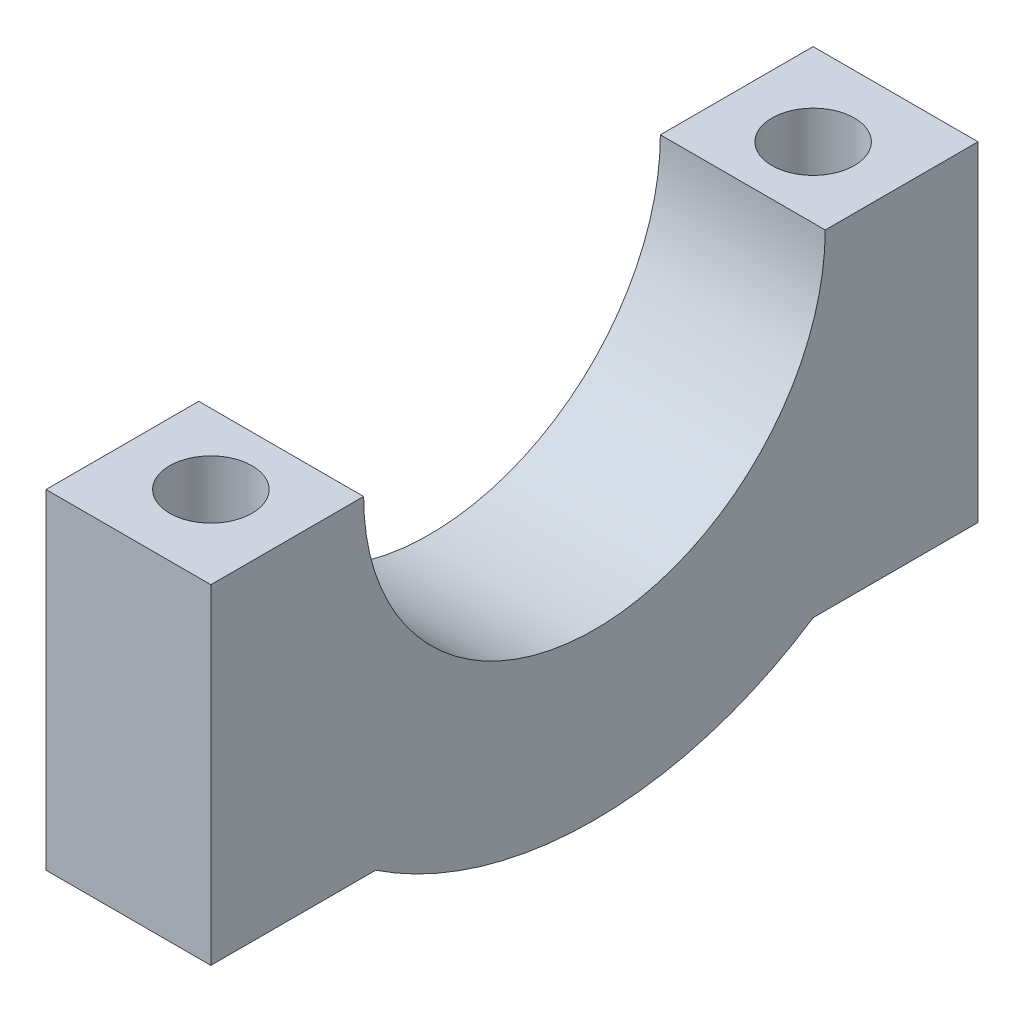
ISO-10303-21;
HEADER;
FILE_DESCRIPTION(('STEP AP214'),'2;1');
FILE_NAME('part.step','',(''),(''),'','','');
FILE_SCHEMA(('AUTOMOTIVE_DESIGN { 1 0 10303 214 1 1 1 1 }'));
ENDSEC;
DATA;
#1=APPLICATION_CONTEXT('core data for automotive mechanical design processes');
#2=APPLICATION_PROTOCOL_DEFINITION('international standard','automotive_design',2000,#1);
#3=PRODUCT_CONTEXT('',#1,'mechanical');
#4=PRODUCT('Part','Part','',(#3));
#5=PRODUCT_RELATED_PRODUCT_CATEGORY('part','',(#4));
#6=PRODUCT_DEFINITION_FORMATION('','',#4);
#7=PRODUCT_DEFINITION_CONTEXT('part definition',#1,'design');
#8=PRODUCT_DEFINITION('design','',#6,#7);
#9=PRODUCT_DEFINITION_SHAPE('','',#8);
#10=(LENGTH_UNIT() NAMED_UNIT(*) SI_UNIT(.MILLI.,.METRE.));
#11=(NAMED_UNIT(*) PLANE_ANGLE_UNIT() SI_UNIT($,.RADIAN.));
#12=(NAMED_UNIT(*) SI_UNIT($,.STERADIAN.) SOLID_ANGLE_UNIT());
#13=UNCERTAINTY_MEASURE_WITH_UNIT(LENGTH_MEASURE(1.E-05),#10,'distance_accuracy_value','');
#14=(GEOMETRIC_REPRESENTATION_CONTEXT(3) GLOBAL_UNCERTAINTY_ASSIGNED_CONTEXT((#13)) GLOBAL_UNIT_ASSIGNED_CONTEXT((#10,
#11,#12)) REPRESENTATION_CONTEXT('',''));
#15=CARTESIAN_POINT('',(0.,0.,0.));
#16=DIRECTION('',(0.,0.,1.));
#17=DIRECTION('',(1.,0.,0.));
#18=AXIS2_PLACEMENT_3D('',#15,#16,#17);
#19=CARTESIAN_POINT('',(12.7,0.,0.));
#20=DIRECTION('',(-1.,0.,0.));
#21=DIRECTION('',(0.,0.,1.));
#22=AXIS2_PLACEMENT_3D('',#19,#20,#21);
#23=CYLINDRICAL_SURFACE('',#22,17.78);
#24=CARTESIAN_POINT('',(0.,0.,0.));
#25=DIRECTION('',(-1.,0.,0.));
#26=DIRECTION('',(0.,0.,-1.));
#27=AXIS2_PLACEMENT_3D('',#24,#25,#26);
#28=CIRCLE('',#27,17.78);
#29=CARTESIAN_POINT('',(0.,0.,-17.78));
#30=VERTEX_POINT('',#29);
#31=CARTESIAN_POINT('',(0.,0.,17.78));
#32=VERTEX_POINT('',#31);
#33=EDGE_CURVE('E136',#30,#32,#28,.T.);
#34=ORIENTED_EDGE('',*,*,#33,.T.);
#35=DIRECTION('',(-1.,0.,0.));
#36=VECTOR('',#35,1.);
#37=CARTESIAN_POINT('',(12.7,0.,17.78));
#38=LINE('',#37,#36);
#39=CARTESIAN_POINT('',(12.7,0.,17.78));
#40=VERTEX_POINT('',#39);
#41=EDGE_CURVE('E11',#40,#32,#38,.T.);
#42=ORIENTED_EDGE('',*,*,#41,.F.);
#43=CARTESIAN_POINT('',(12.7,0.,0.));
#44=DIRECTION('',(-1.,0.,0.));
#45=DIRECTION('',(0.,0.,-1.));
#46=AXIS2_PLACEMENT_3D('',#43,#44,#45);
#47=CIRCLE('',#46,17.78);
#48=CARTESIAN_POINT('',(12.7,0.,-17.78));
#49=VERTEX_POINT('',#48);
#50=EDGE_CURVE('E151',#49,#40,#47,.T.);
#51=ORIENTED_EDGE('',*,*,#50,.F.);
#52=DIRECTION('',(-1.,0.,0.));
#53=VECTOR('',#52,1.);
#54=CARTESIAN_POINT('',(12.7,0.,-17.78));
#55=LINE('',#54,#53);
#56=EDGE_CURVE('E132',#49,#30,#55,.T.);
#57=ORIENTED_EDGE('',*,*,#56,.T.);
#58=EDGE_LOOP('',(#34,#42,#51,#57));
#59=FACE_BOUND('',#58,.T.);
#60=ADVANCED_FACE('F40',(#59),#23,.F.);
#61=CARTESIAN_POINT('',(12.7,0.,17.78));
#62=DIRECTION('',(0.,-1.,0.));
#63=DIRECTION('',(0.,0.,-1.));
#64=AXIS2_PLACEMENT_3D('',#61,#62,#63);
#65=PLANE('',#64);
#66=CARTESIAN_POINT('',(6.35,0.,23.1984539350054));
#67=DIRECTION('',(0.,-1.,0.));
#68=DIRECTION('',(0.,0.,-1.));
#69=AXIS2_PLACEMENT_3D('',#66,#67,#68);
#70=CIRCLE('',#69,3.175);
#71=CARTESIAN_POINT('',(6.35,0.,20.0234539350054));
#72=VERTEX_POINT('',#71);
#73=EDGE_CURVE('E184',#72,#72,#70,.T.);
#74=ORIENTED_EDGE('',*,*,#73,.T.);
#75=EDGE_LOOP('',(#74));
#76=FACE_BOUND('',#75,.T.);
#77=DIRECTION('',(0.,0.,1.));
#78=VECTOR('',#77,1.);
#79=CARTESIAN_POINT('',(0.,0.,17.78));
#80=LINE('',#79,#78);
#81=CARTESIAN_POINT('',(0.,0.,29.5484539350054));
#82=VERTEX_POINT('',#81);
#83=EDGE_CURVE('E139',#32,#82,#80,.T.);
#84=ORIENTED_EDGE('',*,*,#83,.T.);
#85=DIRECTION('',(-1.,0.,0.));
#86=VECTOR('',#85,1.);
#87=CARTESIAN_POINT('',(12.7,0.,29.5484539350054));
#88=LINE('',#87,#86);
#89=CARTESIAN_POINT('',(12.7,0.,29.5484539350054));
#90=VERTEX_POINT('',#89);
#91=EDGE_CURVE('E48',#90,#82,#88,.T.);
#92=ORIENTED_EDGE('',*,*,#91,.F.);
#93=DIRECTION('',(0.,0.,1.));
#94=VECTOR('',#93,1.);
#95=CARTESIAN_POINT('',(12.7,0.,17.78));
#96=LINE('',#95,#94);
#97=EDGE_CURVE('E99',#40,#90,#96,.T.);
#98=ORIENTED_EDGE('',*,*,#97,.F.);
#99=ORIENTED_EDGE('',*,*,#41,.T.);
#100=EDGE_LOOP('',(#84,#92,#98,#99));
#101=FACE_BOUND('',#100,.T.);
#102=ADVANCED_FACE('F216',(#76,#101),#65,.F.);
#103=CARTESIAN_POINT('',(12.7,0.,29.5484539350054));
#104=DIRECTION('',(0.,0.,-1.));
#105=DIRECTION('',(-1.,0.,0.));
#106=AXIS2_PLACEMENT_3D('',#103,#104,#105);
#107=PLANE('',#106);
#108=DIRECTION('',(0.,-1.,0.));
#109=VECTOR('',#108,1.);
#110=CARTESIAN_POINT('',(0.,0.,29.5484539350054));
#111=LINE('',#110,#109);
#112=CARTESIAN_POINT('',(0.,-25.4,29.5484539350054));
#113=VERTEX_POINT('',#112);
#114=EDGE_CURVE('E142',#82,#113,#111,.T.);
#115=ORIENTED_EDGE('',*,*,#114,.T.);
#116=DIRECTION('',(-1.,0.,0.));
#117=VECTOR('',#116,1.);
#118=CARTESIAN_POINT('',(12.7,-25.4,29.5484539350054));
#119=LINE('',#118,#117);
#120=CARTESIAN_POINT('',(12.7,-25.4,29.5484539350054));
#121=VERTEX_POINT('',#120);
#122=EDGE_CURVE('E158',#121,#113,#119,.T.);
#123=ORIENTED_EDGE('',*,*,#122,.F.);
#124=DIRECTION('',(0.,-1.,0.));
#125=VECTOR('',#124,1.);
#126=CARTESIAN_POINT('',(12.7,0.,29.5484539350054));
#127=LINE('',#126,#125);
#128=EDGE_CURVE('E166',#90,#121,#127,.T.);
#129=ORIENTED_EDGE('',*,*,#128,.F.);
#130=ORIENTED_EDGE('',*,*,#91,.T.);
#131=EDGE_LOOP('',(#115,#123,#129,#130));
#132=FACE_BOUND('',#131,.T.);
#133=ADVANCED_FACE('F164',(#132),#107,.F.);
#134=CARTESIAN_POINT('',(12.7,-25.4,29.5484539350054));
#135=DIRECTION('',(0.,1.,0.));
#136=DIRECTION('',(0.,0.,1.));
#137=AXIS2_PLACEMENT_3D('',#134,#135,#136);
#138=PLANE('',#137);
#139=CARTESIAN_POINT('',(6.35,-25.4,23.1984539350054));
#140=DIRECTION('',(0.,-1.,0.));
#141=DIRECTION('',(0.,0.,-1.));
#142=AXIS2_PLACEMENT_3D('',#139,#140,#141);
#143=CIRCLE('',#142,3.175);
#144=CARTESIAN_POINT('',(6.35,-25.4,20.0234539350054));
#145=VERTEX_POINT('',#144);
#146=EDGE_CURVE('E187',#145,#145,#143,.T.);
#147=ORIENTED_EDGE('',*,*,#146,.F.);
#148=EDGE_LOOP('',(#147));
#149=FACE_BOUND('',#148,.T.);
#150=DIRECTION('',(0.,0.,-1.));
#151=VECTOR('',#150,1.);
#152=CARTESIAN_POINT('',(0.,-25.4,29.5484539350054));
#153=LINE('',#152,#151);
#154=CARTESIAN_POINT('',(0.,-25.4,16.8484539350054));
#155=VERTEX_POINT('',#154);
#156=EDGE_CURVE('E144',#113,#155,#153,.T.);
#157=ORIENTED_EDGE('',*,*,#156,.T.);
#158=DIRECTION('',(-1.,0.,0.));
#159=VECTOR('',#158,1.);
#160=CARTESIAN_POINT('',(12.7,-25.4,16.8484539350054));
#161=LINE('',#160,#159);
#162=CARTESIAN_POINT('',(12.7,-25.4,16.8484539350054));
#163=VERTEX_POINT('',#162);
#164=EDGE_CURVE('E155',#163,#155,#161,.T.);
#165=ORIENTED_EDGE('',*,*,#164,.F.);
#166=DIRECTION('',(0.,0.,-1.));
#167=VECTOR('',#166,1.);
#168=CARTESIAN_POINT('',(12.7,-25.4,29.5484539350054));
#169=LINE('',#168,#167);
#170=EDGE_CURVE('E178',#121,#163,#169,.T.);
#171=ORIENTED_EDGE('',*,*,#170,.F.);
#172=ORIENTED_EDGE('',*,*,#122,.T.);
#173=EDGE_LOOP('',(#157,#165,#171,#172));
#174=FACE_BOUND('',#173,.T.);
#175=ADVANCED_FACE('F174',(#149,#174),#138,.F.);
#176=CARTESIAN_POINT('',(12.7,0.,0.));
#177=DIRECTION('',(-1.,0.,0.));
#178=DIRECTION('',(0.,0.,1.));
#179=AXIS2_PLACEMENT_3D('',#176,#177,#178);
#180=CYLINDRICAL_SURFACE('',#179,30.48);
#181=CARTESIAN_POINT('',(0.,0.,0.));
#182=DIRECTION('',(1.,0.,0.));
#183=DIRECTION('',(0.,0.,-1.));
#184=AXIS2_PLACEMENT_3D('',#181,#182,#183);
#185=CIRCLE('',#184,30.48);
#186=CARTESIAN_POINT('',(0.,-25.4,-16.8484539350054));
#187=VERTEX_POINT('',#186);
#188=EDGE_CURVE('E146',#155,#187,#185,.T.);
#189=ORIENTED_EDGE('',*,*,#188,.T.);
#190=DIRECTION('',(-1.,0.,0.));
#191=VECTOR('',#190,1.);
#192=CARTESIAN_POINT('',(12.7,-25.4,-16.8484539350054));
#193=LINE('',#192,#191);
#194=CARTESIAN_POINT('',(12.7,-25.4,-16.8484539350054));
#195=VERTEX_POINT('',#194);
#196=EDGE_CURVE('E127',#195,#187,#193,.T.);
#197=ORIENTED_EDGE('',*,*,#196,.F.);
#198=CARTESIAN_POINT('',(12.7,0.,0.));
#199=DIRECTION('',(1.,0.,0.));
#200=DIRECTION('',(0.,0.,-1.));
#201=AXIS2_PLACEMENT_3D('',#198,#199,#200);
#202=CIRCLE('',#201,30.48);
#203=EDGE_CURVE('E118',#163,#195,#202,.T.);
#204=ORIENTED_EDGE('',*,*,#203,.F.);
#205=ORIENTED_EDGE('',*,*,#164,.T.);
#206=EDGE_LOOP('',(#189,#197,#204,#205));
#207=FACE_BOUND('',#206,.T.);
#208=ADVANCED_FACE('F177',(#207),#180,.T.);
#209=CARTESIAN_POINT('',(12.7,-25.4,-29.5484539350054));
#210=DIRECTION('',(0.,1.,0.));
#211=DIRECTION('',(0.,0.,1.));
#212=AXIS2_PLACEMENT_3D('',#209,#210,#211);
#213=PLANE('',#212);
#214=CARTESIAN_POINT('',(6.35,-25.4,-23.1984539350054));
#215=DIRECTION('',(0.,-1.,0.));
#216=DIRECTION('',(0.,0.,1.));
#217=AXIS2_PLACEMENT_3D('',#214,#215,#216);
#218=CIRCLE('',#217,3.175);
#219=CARTESIAN_POINT('',(6.35,-25.4,-20.0234539350054));
#220=VERTEX_POINT('',#219);
#221=EDGE_CURVE('E190',#220,#220,#218,.T.);
#222=ORIENTED_EDGE('',*,*,#221,.F.);
#223=EDGE_LOOP('',(#222));
#224=FACE_BOUND('',#223,.T.);
#225=DIRECTION('',(0.,0.,-1.));
#226=VECTOR('',#225,1.);
#227=CARTESIAN_POINT('',(0.,-25.4,-29.5484539350054));
#228=LINE('',#227,#226);
#229=CARTESIAN_POINT('',(0.,-25.4,-29.5484539350054));
#230=VERTEX_POINT('',#229);
#231=EDGE_CURVE('E126',#187,#230,#228,.T.);
#232=ORIENTED_EDGE('',*,*,#231,.T.);
#233=DIRECTION('',(-1.,0.,0.));
#234=VECTOR('',#233,1.);
#235=CARTESIAN_POINT('',(12.7,-25.4,-29.5484539350054));
#236=LINE('',#235,#234);
#237=CARTESIAN_POINT('',(12.7,-25.4,-29.5484539350054));
#238=VERTEX_POINT('',#237);
#239=EDGE_CURVE('E123',#238,#230,#236,.T.);
#240=ORIENTED_EDGE('',*,*,#239,.F.);
#241=DIRECTION('',(0.,0.,-1.));
#242=VECTOR('',#241,1.);
#243=CARTESIAN_POINT('',(12.7,-25.4,-29.5484539350054));
#244=LINE('',#243,#242);
#245=EDGE_CURVE('E112',#195,#238,#244,.T.);
#246=ORIENTED_EDGE('',*,*,#245,.F.);
#247=ORIENTED_EDGE('',*,*,#196,.T.);
#248=EDGE_LOOP('',(#232,#240,#246,#247));
#249=FACE_BOUND('',#248,.T.);
#250=ADVANCED_FACE('F124',(#224,#249),#213,.F.);
#251=CARTESIAN_POINT('',(12.7,0.,-29.5484539350054));
#252=DIRECTION('',(0.,0.,1.));
#253=DIRECTION('',(1.,0.,0.));
#254=AXIS2_PLACEMENT_3D('',#251,#252,#253);
#255=PLANE('',#254);
#256=DIRECTION('',(0.,1.,0.));
#257=VECTOR('',#256,1.);
#258=CARTESIAN_POINT('',(0.,0.,-29.5484539350054));
#259=LINE('',#258,#257);
#260=CARTESIAN_POINT('',(0.,0.,-29.5484539350054));
#261=VERTEX_POINT('',#260);
#262=EDGE_CURVE('E85',#230,#261,#259,.T.);
#263=ORIENTED_EDGE('',*,*,#262,.T.);
#264=DIRECTION('',(-1.,0.,0.));
#265=VECTOR('',#264,1.);
#266=CARTESIAN_POINT('',(12.7,0.,-29.5484539350054));
#267=LINE('',#266,#265);
#268=CARTESIAN_POINT('',(12.7,0.,-29.5484539350054));
#269=VERTEX_POINT('',#268);
#270=EDGE_CURVE('E128',#269,#261,#267,.T.);
#271=ORIENTED_EDGE('',*,*,#270,.F.);
#272=DIRECTION('',(0.,1.,0.));
#273=VECTOR('',#272,1.);
#274=CARTESIAN_POINT('',(12.7,0.,-29.5484539350054));
#275=LINE('',#274,#273);
#276=EDGE_CURVE('E116',#238,#269,#275,.T.);
#277=ORIENTED_EDGE('',*,*,#276,.F.);
#278=ORIENTED_EDGE('',*,*,#239,.T.);
#279=EDGE_LOOP('',(#263,#271,#277,#278));
#280=FACE_BOUND('',#279,.T.);
#281=ADVANCED_FACE('F130',(#280),#255,.F.);
#282=CARTESIAN_POINT('',(12.7,0.,-17.78));
#283=DIRECTION('',(0.,-1.,0.));
#284=DIRECTION('',(0.,0.,-1.));
#285=AXIS2_PLACEMENT_3D('',#282,#283,#284);
#286=PLANE('',#285);
#287=CARTESIAN_POINT('',(6.35,0.,-23.1984539350054));
#288=DIRECTION('',(0.,-1.,0.));
#289=DIRECTION('',(0.,0.,1.));
#290=AXIS2_PLACEMENT_3D('',#287,#288,#289);
#291=CIRCLE('',#290,3.175);
#292=CARTESIAN_POINT('',(6.35,0.,-20.0234539350054));
#293=VERTEX_POINT('',#292);
#294=EDGE_CURVE('E140',#293,#293,#291,.T.);
#295=ORIENTED_EDGE('',*,*,#294,.T.);
#296=EDGE_LOOP('',(#295));
#297=FACE_BOUND('',#296,.T.);
#298=DIRECTION('',(0.,0.,1.));
#299=VECTOR('',#298,1.);
#300=CARTESIAN_POINT('',(0.,0.,-17.78));
#301=LINE('',#300,#299);
#302=EDGE_CURVE('E91',#261,#30,#301,.T.);
#303=ORIENTED_EDGE('',*,*,#302,.T.);
#304=ORIENTED_EDGE('',*,*,#56,.F.);
#305=DIRECTION('',(0.,0.,1.));
#306=VECTOR('',#305,1.);
#307=CARTESIAN_POINT('',(12.7,0.,-17.78));
#308=LINE('',#307,#306);
#309=EDGE_CURVE('E56',#269,#49,#308,.T.);
#310=ORIENTED_EDGE('',*,*,#309,.F.);
#311=ORIENTED_EDGE('',*,*,#270,.T.);
#312=EDGE_LOOP('',(#303,#304,#310,#311));
#313=FACE_BOUND('',#312,.T.);
#314=ADVANCED_FACE('F196',(#297,#313),#286,.F.);
#315=CARTESIAN_POINT('',(12.7,0.,0.));
#316=DIRECTION('',(1.,0.,0.));
#317=DIRECTION('',(0.,0.,-1.));
#318=AXIS2_PLACEMENT_3D('',#315,#316,#317);
#319=PLANE('',#318);
#320=ORIENTED_EDGE('',*,*,#50,.T.);
#321=ORIENTED_EDGE('',*,*,#97,.T.);
#322=ORIENTED_EDGE('',*,*,#128,.T.);
#323=ORIENTED_EDGE('',*,*,#170,.T.);
#324=ORIENTED_EDGE('',*,*,#203,.T.);
#325=ORIENTED_EDGE('',*,*,#245,.T.);
#326=ORIENTED_EDGE('',*,*,#276,.T.);
#327=ORIENTED_EDGE('',*,*,#309,.T.);
#328=EDGE_LOOP('',(#320,#321,#322,#323,#324,#325,#326,#327));
#329=FACE_BOUND('',#328,.T.);
#330=ADVANCED_FACE('F114',(#329),#319,.T.);
#331=CARTESIAN_POINT('',(0.,0.,0.));
#332=DIRECTION('',(1.,0.,0.));
#333=DIRECTION('',(0.,0.,-1.));
#334=AXIS2_PLACEMENT_3D('',#331,#332,#333);
#335=PLANE('',#334);
#336=ORIENTED_EDGE('',*,*,#33,.F.);
#337=ORIENTED_EDGE('',*,*,#302,.F.);
#338=ORIENTED_EDGE('',*,*,#262,.F.);
#339=ORIENTED_EDGE('',*,*,#231,.F.);
#340=ORIENTED_EDGE('',*,*,#188,.F.);
#341=ORIENTED_EDGE('',*,*,#156,.F.);
#342=ORIENTED_EDGE('',*,*,#114,.F.);
#343=ORIENTED_EDGE('',*,*,#83,.F.);
#344=EDGE_LOOP('',(#336,#337,#338,#339,#340,#341,#342,#343));
#345=FACE_BOUND('',#344,.T.);
#346=ADVANCED_FACE('F170',(#345),#335,.F.);
#347=CARTESIAN_POINT('',(6.35,0.,-23.1984539350054));
#348=DIRECTION('',(0.,-1.,0.));
#349=DIRECTION('',(0.,0.,-1.));
#350=AXIS2_PLACEMENT_3D('',#347,#348,#349);
#351=CYLINDRICAL_SURFACE('',#350,3.175);
#352=ORIENTED_EDGE('',*,*,#294,.F.);
#353=EDGE_LOOP('',(#352));
#354=FACE_BOUND('',#353,.T.);
#355=ORIENTED_EDGE('',*,*,#221,.T.);
#356=EDGE_LOOP('',(#355));
#357=FACE_BOUND('',#356,.T.);
#358=ADVANCED_FACE('F198',(#354,#357),#351,.F.);
#359=CARTESIAN_POINT('',(6.35,0.,23.1984539350054));
#360=DIRECTION('',(0.,-1.,0.));
#361=DIRECTION('',(0.,0.,-1.));
#362=AXIS2_PLACEMENT_3D('',#359,#360,#361);
#363=CYLINDRICAL_SURFACE('',#362,3.175);
#364=ORIENTED_EDGE('',*,*,#73,.F.);
#365=EDGE_LOOP('',(#364));
#366=FACE_BOUND('',#365,.T.);
#367=ORIENTED_EDGE('',*,*,#146,.T.);
#368=EDGE_LOOP('',(#367));
#369=FACE_BOUND('',#368,.T.);
#370=ADVANCED_FACE('F201',(#366,#369),#363,.F.);
#371=CLOSED_SHELL('',(#60,#102,#133,#175,#208,#250,#281,#314,#330,#346,#358,#370));
#372=MANIFOLD_SOLID_BREP('B2',#371);
#373=ADVANCED_BREP_SHAPE_REPRESENTATION('',(#18,#372),#14);
#374=SHAPE_DEFINITION_REPRESENTATION(#9,#373);
ENDSEC;
END-ISO-10303-21;
